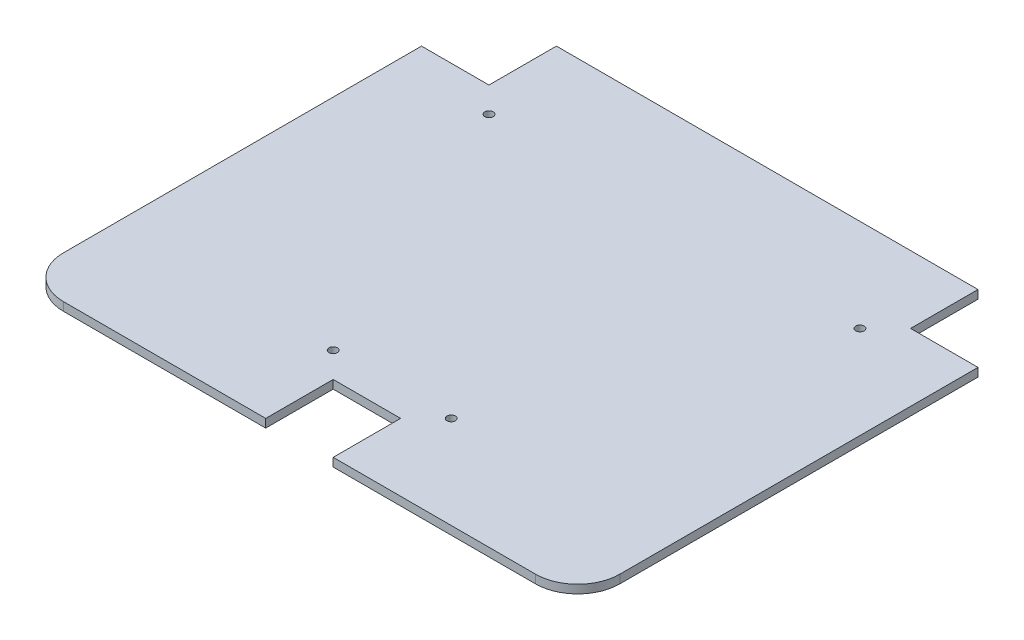
ISO-10303-21;
HEADER;
FILE_DESCRIPTION(('STEP AP214'),'2;1');
FILE_NAME('part.step','',(''),(''),'','','');
FILE_SCHEMA(('AUTOMOTIVE_DESIGN { 1 0 10303 214 1 1 1 1 }'));
ENDSEC;
DATA;
#1=APPLICATION_CONTEXT('core data for automotive mechanical design processes');
#2=APPLICATION_PROTOCOL_DEFINITION('international standard','automotive_design',2000,#1);
#3=PRODUCT_CONTEXT('',#1,'mechanical');
#4=PRODUCT('Part','Part','',(#3));
#5=PRODUCT_RELATED_PRODUCT_CATEGORY('part','',(#4));
#6=PRODUCT_DEFINITION_FORMATION('','',#4);
#7=PRODUCT_DEFINITION_CONTEXT('part definition',#1,'design');
#8=PRODUCT_DEFINITION('design','',#6,#7);
#9=PRODUCT_DEFINITION_SHAPE('','',#8);
#10=(LENGTH_UNIT() NAMED_UNIT(*) SI_UNIT(.MILLI.,.METRE.));
#11=(NAMED_UNIT(*) PLANE_ANGLE_UNIT() SI_UNIT($,.RADIAN.));
#12=(NAMED_UNIT(*) SI_UNIT($,.STERADIAN.) SOLID_ANGLE_UNIT());
#13=UNCERTAINTY_MEASURE_WITH_UNIT(LENGTH_MEASURE(1.E-05),#10,'distance_accuracy_value','');
#14=(GEOMETRIC_REPRESENTATION_CONTEXT(3) GLOBAL_UNCERTAINTY_ASSIGNED_CONTEXT((#13)) GLOBAL_UNIT_ASSIGNED_CONTEXT((#10,
#11,#12)) REPRESENTATION_CONTEXT('',''));
#15=CARTESIAN_POINT('',(0.,0.,0.));
#16=DIRECTION('',(0.,0.,1.));
#17=DIRECTION('',(1.,0.,0.));
#18=AXIS2_PLACEMENT_3D('',#15,#16,#17);
#19=CARTESIAN_POINT('',(0.,5.,155.796995794098));
#20=DIRECTION('',(0.,0.,1.));
#21=DIRECTION('',(1.,0.,0.));
#22=AXIS2_PLACEMENT_3D('',#19,#20,#21);
#23=PLANE('',#22);
#24=DIRECTION('',(-1.,0.,0.));
#25=VECTOR('',#24,1.);
#26=CARTESIAN_POINT('',(0.,0.,155.796995794098));
#27=LINE('',#26,#25);
#28=CARTESIAN_POINT('',(676.267355398383,0.,155.796995794098));
#29=VERTEX_POINT('',#28);
#30=CARTESIAN_POINT('',(556.267355398383,0.,155.796995794098));
#31=VERTEX_POINT('',#30);
#32=EDGE_CURVE('E175',#29,#31,#27,.T.);
#33=ORIENTED_EDGE('',*,*,#32,.F.);
#34=DIRECTION('',(0.,-1.,0.));
#35=VECTOR('',#34,1.);
#36=CARTESIAN_POINT('',(676.267355398383,5.,155.796995794098));
#37=LINE('',#36,#35);
#38=CARTESIAN_POINT('',(676.267355398383,5.,155.796995794098));
#39=VERTEX_POINT('',#38);
#40=EDGE_CURVE('E11',#39,#29,#37,.T.);
#41=ORIENTED_EDGE('',*,*,#40,.F.);
#42=DIRECTION('',(-1.,0.,0.));
#43=VECTOR('',#42,1.);
#44=CARTESIAN_POINT('',(0.,5.,155.796995794098));
#45=LINE('',#44,#43);
#46=CARTESIAN_POINT('',(556.267355398383,5.,155.796995794098));
#47=VERTEX_POINT('',#46);
#48=EDGE_CURVE('E227',#39,#47,#45,.T.);
#49=ORIENTED_EDGE('',*,*,#48,.T.);
#50=DIRECTION('',(0.,-1.,0.));
#51=VECTOR('',#50,1.);
#52=CARTESIAN_POINT('',(556.267355398383,5.,155.796995794098));
#53=LINE('',#52,#51);
#54=EDGE_CURVE('E58',#47,#31,#53,.T.);
#55=ORIENTED_EDGE('',*,*,#54,.T.);
#56=EDGE_LOOP('',(#33,#41,#49,#55));
#57=FACE_BOUND('',#56,.T.);
#58=ADVANCED_FACE('F41',(#57),#23,.T.);
#59=CARTESIAN_POINT('',(676.267355398383,5.,130.796995794098));
#60=DIRECTION('',(0.,-1.,0.));
#61=DIRECTION('',(0.,0.,-1.));
#62=AXIS2_PLACEMENT_3D('',#59,#60,#61);
#63=CYLINDRICAL_SURFACE('',#62,25.);
#64=CARTESIAN_POINT('',(676.267355398383,0.,130.796995794098));
#65=DIRECTION('',(0.,1.,0.));
#66=DIRECTION('',(0.,0.,1.));
#67=AXIS2_PLACEMENT_3D('',#64,#65,#66);
#68=CIRCLE('',#67,25.);
#69=CARTESIAN_POINT('',(701.267355398383,0.,130.796995794098));
#70=VERTEX_POINT('',#69);
#71=EDGE_CURVE('E178',#29,#70,#68,.T.);
#72=ORIENTED_EDGE('',*,*,#71,.T.);
#73=DIRECTION('',(0.,-1.,0.));
#74=VECTOR('',#73,1.);
#75=CARTESIAN_POINT('',(701.267355398383,5.,130.796995794098));
#76=LINE('',#75,#74);
#77=CARTESIAN_POINT('',(701.267355398383,5.,130.796995794098));
#78=VERTEX_POINT('',#77);
#79=EDGE_CURVE('E50',#78,#70,#76,.T.);
#80=ORIENTED_EDGE('',*,*,#79,.F.);
#81=CARTESIAN_POINT('',(676.267355398383,5.,130.796995794098));
#82=DIRECTION('',(0.,1.,0.));
#83=DIRECTION('',(0.,0.,1.));
#84=AXIS2_PLACEMENT_3D('',#81,#82,#83);
#85=CIRCLE('',#84,25.);
#86=EDGE_CURVE('E280',#39,#78,#85,.T.);
#87=ORIENTED_EDGE('',*,*,#86,.F.);
#88=ORIENTED_EDGE('',*,*,#40,.T.);
#89=EDGE_LOOP('',(#72,#80,#87,#88));
#90=FACE_BOUND('',#89,.T.);
#91=ADVANCED_FACE('F268',(#90),#63,.T.);
#92=CARTESIAN_POINT('',(701.267355398383,5.,0.));
#93=DIRECTION('',(1.,0.,0.));
#94=DIRECTION('',(0.,0.,-1.));
#95=AXIS2_PLACEMENT_3D('',#92,#93,#94);
#96=PLANE('',#95);
#97=DIRECTION('',(0.,0.,1.));
#98=VECTOR('',#97,1.);
#99=CARTESIAN_POINT('',(701.267355398383,0.,0.));
#100=LINE('',#99,#98);
#101=CARTESIAN_POINT('',(701.267355398383,0.,-81.5881877590993));
#102=VERTEX_POINT('',#101);
#103=EDGE_CURVE('E183',#102,#70,#100,.T.);
#104=ORIENTED_EDGE('',*,*,#103,.F.);
#105=DIRECTION('',(0.,-1.,0.));
#106=VECTOR('',#105,1.);
#107=CARTESIAN_POINT('',(701.267355398383,5.,-81.5881877590993));
#108=LINE('',#107,#106);
#109=CARTESIAN_POINT('',(701.267355398383,5.,-81.5881877590993));
#110=VERTEX_POINT('',#109);
#111=EDGE_CURVE('E256',#110,#102,#108,.T.);
#112=ORIENTED_EDGE('',*,*,#111,.F.);
#113=DIRECTION('',(0.,0.,1.));
#114=VECTOR('',#113,1.);
#115=CARTESIAN_POINT('',(701.267355398383,5.,0.));
#116=LINE('',#115,#114);
#117=EDGE_CURVE('E265',#110,#78,#116,.T.);
#118=ORIENTED_EDGE('',*,*,#117,.T.);
#119=ORIENTED_EDGE('',*,*,#79,.T.);
#120=EDGE_LOOP('',(#104,#112,#118,#119));
#121=FACE_BOUND('',#120,.T.);
#122=ADVANCED_FACE('F263',(#121),#96,.T.);
#123=CARTESIAN_POINT('',(0.,5.,-81.5881877590993));
#124=DIRECTION('',(0.,0.,-1.));
#125=DIRECTION('',(-1.,0.,0.));
#126=AXIS2_PLACEMENT_3D('',#123,#124,#125);
#127=PLANE('',#126);
#128=DIRECTION('',(1.,0.,0.));
#129=VECTOR('',#128,1.);
#130=CARTESIAN_POINT('',(0.,0.,-81.5881877590993));
#131=LINE('',#130,#129);
#132=CARTESIAN_POINT('',(661.267355398383,0.,-81.5881877590993));
#133=VERTEX_POINT('',#132);
#134=EDGE_CURVE('E187',#133,#102,#131,.T.);
#135=ORIENTED_EDGE('',*,*,#134,.F.);
#136=DIRECTION('',(0.,-1.,0.));
#137=VECTOR('',#136,1.);
#138=CARTESIAN_POINT('',(661.267355398383,5.,-81.5881877590993));
#139=LINE('',#138,#137);
#140=CARTESIAN_POINT('',(661.267355398383,5.,-81.5881877590993));
#141=VERTEX_POINT('',#140);
#142=EDGE_CURVE('E253',#141,#133,#139,.T.);
#143=ORIENTED_EDGE('',*,*,#142,.F.);
#144=DIRECTION('',(1.,0.,0.));
#145=VECTOR('',#144,1.);
#146=CARTESIAN_POINT('',(0.,5.,-81.5881877590993));
#147=LINE('',#146,#145);
#148=EDGE_CURVE('E277',#141,#110,#147,.T.);
#149=ORIENTED_EDGE('',*,*,#148,.T.);
#150=ORIENTED_EDGE('',*,*,#111,.T.);
#151=EDGE_LOOP('',(#135,#143,#149,#150));
#152=FACE_BOUND('',#151,.T.);
#153=ADVANCED_FACE('F274',(#152),#127,.T.);
#154=CARTESIAN_POINT('',(661.267355398383,5.,0.));
#155=DIRECTION('',(1.,0.,0.));
#156=DIRECTION('',(0.,0.,-1.));
#157=AXIS2_PLACEMENT_3D('',#154,#155,#156);
#158=PLANE('',#157);
#159=DIRECTION('',(0.,0.,1.));
#160=VECTOR('',#159,1.);
#161=CARTESIAN_POINT('',(661.267355398383,0.,0.));
#162=LINE('',#161,#160);
#163=CARTESIAN_POINT('',(661.267355398383,0.,-121.588187759099));
#164=VERTEX_POINT('',#163);
#165=EDGE_CURVE('E191',#164,#133,#162,.T.);
#166=ORIENTED_EDGE('',*,*,#165,.F.);
#167=DIRECTION('',(0.,-1.,0.));
#168=VECTOR('',#167,1.);
#169=CARTESIAN_POINT('',(661.267355398383,5.,-121.588187759099));
#170=LINE('',#169,#168);
#171=CARTESIAN_POINT('',(661.267355398383,5.,-121.588187759099));
#172=VERTEX_POINT('',#171);
#173=EDGE_CURVE('E250',#172,#164,#170,.T.);
#174=ORIENTED_EDGE('',*,*,#173,.F.);
#175=DIRECTION('',(0.,0.,1.));
#176=VECTOR('',#175,1.);
#177=CARTESIAN_POINT('',(661.267355398383,5.,0.));
#178=LINE('',#177,#176);
#179=EDGE_CURVE('E285',#172,#141,#178,.T.);
#180=ORIENTED_EDGE('',*,*,#179,.T.);
#181=ORIENTED_EDGE('',*,*,#142,.T.);
#182=EDGE_LOOP('',(#166,#174,#180,#181));
#183=FACE_BOUND('',#182,.T.);
#184=ADVANCED_FACE('F336',(#183),#158,.T.);
#185=CARTESIAN_POINT('',(0.,5.,-121.588187759099));
#186=DIRECTION('',(0.,0.,-1.));
#187=DIRECTION('',(-1.,0.,0.));
#188=AXIS2_PLACEMENT_3D('',#185,#186,#187);
#189=PLANE('',#188);
#190=DIRECTION('',(1.,0.,0.));
#191=VECTOR('',#190,1.);
#192=CARTESIAN_POINT('',(0.,0.,-121.588187759099));
#193=LINE('',#192,#191);
#194=CARTESIAN_POINT('',(411.267355398383,0.,-121.588187759099));
#195=VERTEX_POINT('',#194);
#196=EDGE_CURVE('E195',#195,#164,#193,.T.);
#197=ORIENTED_EDGE('',*,*,#196,.F.);
#198=DIRECTION('',(0.,-1.,0.));
#199=VECTOR('',#198,1.);
#200=CARTESIAN_POINT('',(411.267355398383,5.,-121.588187759099));
#201=LINE('',#200,#199);
#202=CARTESIAN_POINT('',(411.267355398383,5.,-121.588187759099));
#203=VERTEX_POINT('',#202);
#204=EDGE_CURVE('E247',#203,#195,#201,.T.);
#205=ORIENTED_EDGE('',*,*,#204,.F.);
#206=DIRECTION('',(1.,0.,0.));
#207=VECTOR('',#206,1.);
#208=CARTESIAN_POINT('',(0.,5.,-121.588187759099));
#209=LINE('',#208,#207);
#210=EDGE_CURVE('E292',#203,#172,#209,.T.);
#211=ORIENTED_EDGE('',*,*,#210,.T.);
#212=ORIENTED_EDGE('',*,*,#173,.T.);
#213=EDGE_LOOP('',(#197,#205,#211,#212));
#214=FACE_BOUND('',#213,.T.);
#215=ADVANCED_FACE('F339',(#214),#189,.T.);
#216=CARTESIAN_POINT('',(411.267355398383,5.,0.));
#217=DIRECTION('',(1.,0.,0.));
#218=DIRECTION('',(0.,0.,-1.));
#219=AXIS2_PLACEMENT_3D('',#216,#217,#218);
#220=PLANE('',#219);
#221=DIRECTION('',(0.,0.,1.));
#222=VECTOR('',#221,1.);
#223=CARTESIAN_POINT('',(411.267355398383,0.,0.));
#224=LINE('',#223,#222);
#225=CARTESIAN_POINT('',(411.267355398383,0.,-81.5881877590993));
#226=VERTEX_POINT('',#225);
#227=EDGE_CURVE('E199',#195,#226,#224,.T.);
#228=ORIENTED_EDGE('',*,*,#227,.T.);
#229=DIRECTION('',(0.,-1.,0.));
#230=VECTOR('',#229,1.);
#231=CARTESIAN_POINT('',(411.267355398383,5.,-81.5881877590993));
#232=LINE('',#231,#230);
#233=CARTESIAN_POINT('',(411.267355398383,5.,-81.5881877590993));
#234=VERTEX_POINT('',#233);
#235=EDGE_CURVE('E243',#234,#226,#232,.T.);
#236=ORIENTED_EDGE('',*,*,#235,.F.);
#237=DIRECTION('',(0.,0.,1.));
#238=VECTOR('',#237,1.);
#239=CARTESIAN_POINT('',(411.267355398383,5.,0.));
#240=LINE('',#239,#238);
#241=EDGE_CURVE('E296',#203,#234,#240,.T.);
#242=ORIENTED_EDGE('',*,*,#241,.F.);
#243=ORIENTED_EDGE('',*,*,#204,.T.);
#244=EDGE_LOOP('',(#228,#236,#242,#243));
#245=FACE_BOUND('',#244,.T.);
#246=ADVANCED_FACE('F343',(#245),#220,.F.);
#247=CARTESIAN_POINT('',(0.,5.,-81.5881877590993));
#248=DIRECTION('',(0.,0.,1.));
#249=DIRECTION('',(1.,0.,0.));
#250=AXIS2_PLACEMENT_3D('',#247,#248,#249);
#251=PLANE('',#250);
#252=DIRECTION('',(-1.,0.,0.));
#253=VECTOR('',#252,1.);
#254=CARTESIAN_POINT('',(0.,0.,-81.5881877590993));
#255=LINE('',#254,#253);
#256=CARTESIAN_POINT('',(371.267355398383,0.,-81.5881877590993));
#257=VERTEX_POINT('',#256);
#258=EDGE_CURVE('E202',#226,#257,#255,.T.);
#259=ORIENTED_EDGE('',*,*,#258,.T.);
#260=DIRECTION('',(0.,-1.,0.));
#261=VECTOR('',#260,1.);
#262=CARTESIAN_POINT('',(371.267355398383,5.,-81.5881877590993));
#263=LINE('',#262,#261);
#264=CARTESIAN_POINT('',(371.267355398383,5.,-81.5881877590993));
#265=VERTEX_POINT('',#264);
#266=EDGE_CURVE('E240',#265,#257,#263,.T.);
#267=ORIENTED_EDGE('',*,*,#266,.F.);
#268=DIRECTION('',(-1.,0.,0.));
#269=VECTOR('',#268,1.);
#270=CARTESIAN_POINT('',(0.,5.,-81.5881877590993));
#271=LINE('',#270,#269);
#272=EDGE_CURVE('E299',#234,#265,#271,.T.);
#273=ORIENTED_EDGE('',*,*,#272,.F.);
#274=ORIENTED_EDGE('',*,*,#235,.T.);
#275=EDGE_LOOP('',(#259,#267,#273,#274));
#276=FACE_BOUND('',#275,.T.);
#277=ADVANCED_FACE('F347',(#276),#251,.F.);
#278=CARTESIAN_POINT('',(371.267355398383,5.,0.));
#279=DIRECTION('',(-1.,0.,0.));
#280=DIRECTION('',(0.,0.,1.));
#281=AXIS2_PLACEMENT_3D('',#278,#279,#280);
#282=PLANE('',#281);
#283=DIRECTION('',(0.,0.,-1.));
#284=VECTOR('',#283,1.);
#285=CARTESIAN_POINT('',(371.267355398383,0.,0.));
#286=LINE('',#285,#284);
#287=CARTESIAN_POINT('',(371.267355398383,0.,130.796995794098));
#288=VERTEX_POINT('',#287);
#289=EDGE_CURVE('E206',#288,#257,#286,.T.);
#290=ORIENTED_EDGE('',*,*,#289,.F.);
#291=DIRECTION('',(0.,-1.,0.));
#292=VECTOR('',#291,1.);
#293=CARTESIAN_POINT('',(371.267355398383,5.,130.796995794098));
#294=LINE('',#293,#292);
#295=CARTESIAN_POINT('',(371.267355398383,5.,130.796995794098));
#296=VERTEX_POINT('',#295);
#297=EDGE_CURVE('E237',#296,#288,#294,.T.);
#298=ORIENTED_EDGE('',*,*,#297,.F.);
#299=DIRECTION('',(0.,0.,-1.));
#300=VECTOR('',#299,1.);
#301=CARTESIAN_POINT('',(371.267355398383,5.,0.));
#302=LINE('',#301,#300);
#303=EDGE_CURVE('E302',#296,#265,#302,.T.);
#304=ORIENTED_EDGE('',*,*,#303,.T.);
#305=ORIENTED_EDGE('',*,*,#266,.T.);
#306=EDGE_LOOP('',(#290,#298,#304,#305));
#307=FACE_BOUND('',#306,.T.);
#308=ADVANCED_FACE('F351',(#307),#282,.T.);
#309=CARTESIAN_POINT('',(396.267355398383,5.,130.796995794098));
#310=DIRECTION('',(0.,-1.,0.));
#311=DIRECTION('',(0.,0.,-1.));
#312=AXIS2_PLACEMENT_3D('',#309,#310,#311);
#313=CYLINDRICAL_SURFACE('',#312,25.);
#314=CARTESIAN_POINT('',(396.267355398383,0.,130.796995794098));
#315=DIRECTION('',(0.,1.,0.));
#316=DIRECTION('',(0.,0.,1.));
#317=AXIS2_PLACEMENT_3D('',#314,#315,#316);
#318=CIRCLE('',#317,25.);
#319=CARTESIAN_POINT('',(396.267355398384,0.,155.796995794098));
#320=VERTEX_POINT('',#319);
#321=EDGE_CURVE('E210',#288,#320,#318,.T.);
#322=ORIENTED_EDGE('',*,*,#321,.T.);
#323=DIRECTION('',(0.,-1.,0.));
#324=VECTOR('',#323,1.);
#325=CARTESIAN_POINT('',(396.267355398384,5.,155.796995794098));
#326=LINE('',#325,#324);
#327=CARTESIAN_POINT('',(396.267355398384,5.,155.796995794098));
#328=VERTEX_POINT('',#327);
#329=EDGE_CURVE('E234',#328,#320,#326,.T.);
#330=ORIENTED_EDGE('',*,*,#329,.F.);
#331=CARTESIAN_POINT('',(396.267355398383,5.,130.796995794098));
#332=DIRECTION('',(0.,1.,0.));
#333=DIRECTION('',(0.,0.,1.));
#334=AXIS2_PLACEMENT_3D('',#331,#332,#333);
#335=CIRCLE('',#334,25.);
#336=EDGE_CURVE('E306',#296,#328,#335,.T.);
#337=ORIENTED_EDGE('',*,*,#336,.F.);
#338=ORIENTED_EDGE('',*,*,#297,.T.);
#339=EDGE_LOOP('',(#322,#330,#337,#338));
#340=FACE_BOUND('',#339,.T.);
#341=ADVANCED_FACE('F355',(#340),#313,.T.);
#342=CARTESIAN_POINT('',(0.,5.,155.796995794098));
#343=DIRECTION('',(0.,0.,1.));
#344=DIRECTION('',(1.,0.,0.));
#345=AXIS2_PLACEMENT_3D('',#342,#343,#344);
#346=PLANE('',#345);
#347=DIRECTION('',(-1.,0.,0.));
#348=VECTOR('',#347,1.);
#349=CARTESIAN_POINT('',(0.,0.,155.796995794098));
#350=LINE('',#349,#348);
#351=CARTESIAN_POINT('',(516.267355398383,0.,155.796995794098));
#352=VERTEX_POINT('',#351);
#353=EDGE_CURVE('E214',#352,#320,#350,.T.);
#354=ORIENTED_EDGE('',*,*,#353,.F.);
#355=DIRECTION('',(0.,-1.,0.));
#356=VECTOR('',#355,1.);
#357=CARTESIAN_POINT('',(516.267355398383,5.,155.796995794098));
#358=LINE('',#357,#356);
#359=CARTESIAN_POINT('',(516.267355398383,5.,155.796995794098));
#360=VERTEX_POINT('',#359);
#361=EDGE_CURVE('E154',#360,#352,#358,.T.);
#362=ORIENTED_EDGE('',*,*,#361,.F.);
#363=DIRECTION('',(-1.,0.,0.));
#364=VECTOR('',#363,1.);
#365=CARTESIAN_POINT('',(0.,5.,155.796995794098));
#366=LINE('',#365,#364);
#367=EDGE_CURVE('E164',#360,#328,#366,.T.);
#368=ORIENTED_EDGE('',*,*,#367,.T.);
#369=ORIENTED_EDGE('',*,*,#329,.T.);
#370=EDGE_LOOP('',(#354,#362,#368,#369));
#371=FACE_BOUND('',#370,.T.);
#372=ADVANCED_FACE('F311',(#371),#346,.T.);
#373=CARTESIAN_POINT('',(516.267355398383,5.,0.));
#374=DIRECTION('',(1.,0.,0.));
#375=DIRECTION('',(0.,0.,-1.));
#376=AXIS2_PLACEMENT_3D('',#373,#374,#375);
#377=PLANE('',#376);
#378=DIRECTION('',(0.,0.,1.));
#379=VECTOR('',#378,1.);
#380=CARTESIAN_POINT('',(516.267355398383,0.,0.));
#381=LINE('',#380,#379);
#382=CARTESIAN_POINT('',(516.267355398383,0.,115.796995794098));
#383=VERTEX_POINT('',#382);
#384=EDGE_CURVE('E149',#383,#352,#381,.T.);
#385=ORIENTED_EDGE('',*,*,#384,.F.);
#386=DIRECTION('',(0.,-1.,0.));
#387=VECTOR('',#386,1.);
#388=CARTESIAN_POINT('',(516.267355398383,5.,115.796995794098));
#389=LINE('',#388,#387);
#390=CARTESIAN_POINT('',(516.267355398383,5.,115.796995794098));
#391=VERTEX_POINT('',#390);
#392=EDGE_CURVE('E144',#391,#383,#389,.T.);
#393=ORIENTED_EDGE('',*,*,#392,.F.);
#394=DIRECTION('',(0.,0.,1.));
#395=VECTOR('',#394,1.);
#396=CARTESIAN_POINT('',(516.267355398383,5.,0.));
#397=LINE('',#396,#395);
#398=EDGE_CURVE('E147',#391,#360,#397,.T.);
#399=ORIENTED_EDGE('',*,*,#398,.T.);
#400=ORIENTED_EDGE('',*,*,#361,.T.);
#401=EDGE_LOOP('',(#385,#393,#399,#400));
#402=FACE_BOUND('',#401,.T.);
#403=ADVANCED_FACE('F146',(#402),#377,.T.);
#404=CARTESIAN_POINT('',(0.,5.,115.796995794098));
#405=DIRECTION('',(0.,0.,1.));
#406=DIRECTION('',(1.,0.,0.));
#407=AXIS2_PLACEMENT_3D('',#404,#405,#406);
#408=PLANE('',#407);
#409=DIRECTION('',(-1.,0.,0.));
#410=VECTOR('',#409,1.);
#411=CARTESIAN_POINT('',(0.,0.,115.796995794098));
#412=LINE('',#411,#410);
#413=CARTESIAN_POINT('',(556.267355398383,0.,115.796995794098));
#414=VERTEX_POINT('',#413);
#415=EDGE_CURVE('E220',#414,#383,#412,.T.);
#416=ORIENTED_EDGE('',*,*,#415,.F.);
#417=DIRECTION('',(0.,-1.,0.));
#418=VECTOR('',#417,1.);
#419=CARTESIAN_POINT('',(556.267355398383,5.,115.796995794098));
#420=LINE('',#419,#418);
#421=CARTESIAN_POINT('',(556.267355398383,5.,115.796995794098));
#422=VERTEX_POINT('',#421);
#423=EDGE_CURVE('E101',#422,#414,#420,.T.);
#424=ORIENTED_EDGE('',*,*,#423,.F.);
#425=DIRECTION('',(-1.,0.,0.));
#426=VECTOR('',#425,1.);
#427=CARTESIAN_POINT('',(0.,5.,115.796995794098));
#428=LINE('',#427,#426);
#429=EDGE_CURVE('E162',#422,#391,#428,.T.);
#430=ORIENTED_EDGE('',*,*,#429,.T.);
#431=ORIENTED_EDGE('',*,*,#392,.T.);
#432=EDGE_LOOP('',(#416,#424,#430,#431));
#433=FACE_BOUND('',#432,.T.);
#434=ADVANCED_FACE('F167',(#433),#408,.T.);
#435=CARTESIAN_POINT('',(556.267355398383,5.,0.));
#436=DIRECTION('',(-1.,0.,0.));
#437=DIRECTION('',(0.,0.,1.));
#438=AXIS2_PLACEMENT_3D('',#435,#436,#437);
#439=PLANE('',#438);
#440=DIRECTION('',(0.,0.,-1.));
#441=VECTOR('',#440,1.);
#442=CARTESIAN_POINT('',(556.267355398383,0.,0.));
#443=LINE('',#442,#441);
#444=EDGE_CURVE('E223',#31,#414,#443,.T.);
#445=ORIENTED_EDGE('',*,*,#444,.F.);
#446=ORIENTED_EDGE('',*,*,#54,.F.);
#447=DIRECTION('',(0.,0.,-1.));
#448=VECTOR('',#447,1.);
#449=CARTESIAN_POINT('',(556.267355398383,5.,0.));
#450=LINE('',#449,#448);
#451=EDGE_CURVE('E169',#47,#422,#450,.T.);
#452=ORIENTED_EDGE('',*,*,#451,.T.);
#453=ORIENTED_EDGE('',*,*,#423,.T.);
#454=EDGE_LOOP('',(#445,#446,#452,#453));
#455=FACE_BOUND('',#454,.T.);
#456=ADVANCED_FACE('F314',(#455),#439,.T.);
#457=CARTESIAN_POINT('',(0.,5.,0.));
#458=DIRECTION('',(0.,1.,0.));
#459=DIRECTION('',(0.,0.,1.));
#460=AXIS2_PLACEMENT_3D('',#457,#458,#459);
#461=PLANE('',#460);
#462=CARTESIAN_POINT('',(426.267355398383,5.,-66.5881877590993));
#463=DIRECTION('',(0.,1.,0.));
#464=DIRECTION('',(0.,0.,1.));
#465=AXIS2_PLACEMENT_3D('',#462,#463,#464);
#466=CIRCLE('',#465,2.50000000000002);
#467=CARTESIAN_POINT('',(426.267355398383,5.,-64.0881877590993));
#468=VERTEX_POINT('',#467);
#469=EDGE_CURVE('E439',#468,#468,#466,.T.);
#470=ORIENTED_EDGE('',*,*,#469,.F.);
#471=EDGE_LOOP('',(#470));
#472=FACE_BOUND('',#471,.T.);
#473=CARTESIAN_POINT('',(646.267355398383,5.,-66.5881877590992));
#474=DIRECTION('',(0.,1.,0.));
#475=DIRECTION('',(0.,0.,1.));
#476=AXIS2_PLACEMENT_3D('',#473,#474,#475);
#477=CIRCLE('',#476,2.50000000000003);
#478=CARTESIAN_POINT('',(646.267355398383,5.,-64.0881877590992));
#479=VERTEX_POINT('',#478);
#480=EDGE_CURVE('E443',#479,#479,#477,.T.);
#481=ORIENTED_EDGE('',*,*,#480,.F.);
#482=EDGE_LOOP('',(#481));
#483=FACE_BOUND('',#482,.T.);
#484=CARTESIAN_POINT('',(501.267355398383,5.,100.796995794098));
#485=DIRECTION('',(0.,1.,0.));
#486=DIRECTION('',(0.,0.,1.));
#487=AXIS2_PLACEMENT_3D('',#484,#485,#486);
#488=CIRCLE('',#487,2.50000000000003);
#489=CARTESIAN_POINT('',(501.267355398383,5.,103.296995794098));
#490=VERTEX_POINT('',#489);
#491=EDGE_CURVE('E458',#490,#490,#488,.T.);
#492=ORIENTED_EDGE('',*,*,#491,.F.);
#493=EDGE_LOOP('',(#492));
#494=FACE_BOUND('',#493,.T.);
#495=CARTESIAN_POINT('',(571.267355398383,5.,100.796995794098));
#496=DIRECTION('',(0.,1.,0.));
#497=DIRECTION('',(0.,0.,1.));
#498=AXIS2_PLACEMENT_3D('',#495,#496,#497);
#499=CIRCLE('',#498,2.50000000000003);
#500=CARTESIAN_POINT('',(571.267355398383,5.,103.296995794098));
#501=VERTEX_POINT('',#500);
#502=EDGE_CURVE('E450',#501,#501,#499,.T.);
#503=ORIENTED_EDGE('',*,*,#502,.F.);
#504=EDGE_LOOP('',(#503));
#505=FACE_BOUND('',#504,.T.);
#506=ORIENTED_EDGE('',*,*,#48,.F.);
#507=ORIENTED_EDGE('',*,*,#86,.T.);
#508=ORIENTED_EDGE('',*,*,#117,.F.);
#509=ORIENTED_EDGE('',*,*,#148,.F.);
#510=ORIENTED_EDGE('',*,*,#179,.F.);
#511=ORIENTED_EDGE('',*,*,#210,.F.);
#512=ORIENTED_EDGE('',*,*,#241,.T.);
#513=ORIENTED_EDGE('',*,*,#272,.T.);
#514=ORIENTED_EDGE('',*,*,#303,.F.);
#515=ORIENTED_EDGE('',*,*,#336,.T.);
#516=ORIENTED_EDGE('',*,*,#367,.F.);
#517=ORIENTED_EDGE('',*,*,#398,.F.);
#518=ORIENTED_EDGE('',*,*,#429,.F.);
#519=ORIENTED_EDGE('',*,*,#451,.F.);
#520=EDGE_LOOP('',(#506,#507,#508,#509,#510,#511,#512,#513,#514,#515,#516,#517,#518,#519));
#521=FACE_BOUND('',#520,.T.);
#522=ADVANCED_FACE('F160',(#472,#483,#494,#505,#521),#461,.T.);
#523=CARTESIAN_POINT('',(0.,0.,0.));
#524=DIRECTION('',(0.,1.,0.));
#525=DIRECTION('',(0.,0.,1.));
#526=AXIS2_PLACEMENT_3D('',#523,#524,#525);
#527=PLANE('',#526);
#528=CARTESIAN_POINT('',(426.267355398383,0.,-66.5881877590993));
#529=DIRECTION('',(0.,1.,0.));
#530=DIRECTION('',(0.,0.,1.));
#531=AXIS2_PLACEMENT_3D('',#528,#529,#530);
#532=CIRCLE('',#531,2.50000000000002);
#533=CARTESIAN_POINT('',(426.267355398383,0.,-64.0881877590993));
#534=VERTEX_POINT('',#533);
#535=EDGE_CURVE('E436',#534,#534,#532,.T.);
#536=ORIENTED_EDGE('',*,*,#535,.T.);
#537=EDGE_LOOP('',(#536));
#538=FACE_BOUND('',#537,.T.);
#539=CARTESIAN_POINT('',(646.267355398383,0.,-66.5881877590992));
#540=DIRECTION('',(0.,1.,0.));
#541=DIRECTION('',(0.,0.,1.));
#542=AXIS2_PLACEMENT_3D('',#539,#540,#541);
#543=CIRCLE('',#542,2.50000000000003);
#544=CARTESIAN_POINT('',(646.267355398383,0.,-64.0881877590992));
#545=VERTEX_POINT('',#544);
#546=EDGE_CURVE('E462',#545,#545,#543,.T.);
#547=ORIENTED_EDGE('',*,*,#546,.T.);
#548=EDGE_LOOP('',(#547));
#549=FACE_BOUND('',#548,.T.);
#550=CARTESIAN_POINT('',(501.267355398383,0.,100.796995794098));
#551=DIRECTION('',(0.,1.,0.));
#552=DIRECTION('',(0.,0.,1.));
#553=AXIS2_PLACEMENT_3D('',#550,#551,#552);
#554=CIRCLE('',#553,2.50000000000003);
#555=CARTESIAN_POINT('',(501.267355398383,0.,103.296995794098));
#556=VERTEX_POINT('',#555);
#557=EDGE_CURVE('E453',#556,#556,#554,.T.);
#558=ORIENTED_EDGE('',*,*,#557,.T.);
#559=EDGE_LOOP('',(#558));
#560=FACE_BOUND('',#559,.T.);
#561=CARTESIAN_POINT('',(571.267355398383,0.,100.796995794098));
#562=DIRECTION('',(0.,1.,0.));
#563=DIRECTION('',(0.,0.,1.));
#564=AXIS2_PLACEMENT_3D('',#561,#562,#563);
#565=CIRCLE('',#564,2.50000000000003);
#566=CARTESIAN_POINT('',(571.267355398383,0.,103.296995794098));
#567=VERTEX_POINT('',#566);
#568=EDGE_CURVE('E179',#567,#567,#565,.T.);
#569=ORIENTED_EDGE('',*,*,#568,.T.);
#570=EDGE_LOOP('',(#569));
#571=FACE_BOUND('',#570,.T.);
#572=ORIENTED_EDGE('',*,*,#32,.T.);
#573=ORIENTED_EDGE('',*,*,#444,.T.);
#574=ORIENTED_EDGE('',*,*,#415,.T.);
#575=ORIENTED_EDGE('',*,*,#384,.T.);
#576=ORIENTED_EDGE('',*,*,#353,.T.);
#577=ORIENTED_EDGE('',*,*,#321,.F.);
#578=ORIENTED_EDGE('',*,*,#289,.T.);
#579=ORIENTED_EDGE('',*,*,#258,.F.);
#580=ORIENTED_EDGE('',*,*,#227,.F.);
#581=ORIENTED_EDGE('',*,*,#196,.T.);
#582=ORIENTED_EDGE('',*,*,#165,.T.);
#583=ORIENTED_EDGE('',*,*,#134,.T.);
#584=ORIENTED_EDGE('',*,*,#103,.T.);
#585=ORIENTED_EDGE('',*,*,#71,.F.);
#586=EDGE_LOOP('',(#572,#573,#574,#575,#576,#577,#578,#579,#580,#581,#582,#583,#584,#585));
#587=FACE_BOUND('',#586,.T.);
#588=ADVANCED_FACE('F270',(#538,#549,#560,#571,#587),#527,.F.);
#589=CARTESIAN_POINT('',(571.267355398383,0.,100.796995794098));
#590=DIRECTION('',(0.,1.,0.));
#591=DIRECTION('',(0.,0.,1.));
#592=AXIS2_PLACEMENT_3D('',#589,#590,#591);
#593=CYLINDRICAL_SURFACE('',#592,2.50000000000003);
#594=ORIENTED_EDGE('',*,*,#568,.F.);
#595=EDGE_LOOP('',(#594));
#596=FACE_BOUND('',#595,.T.);
#597=ORIENTED_EDGE('',*,*,#502,.T.);
#598=EDGE_LOOP('',(#597));
#599=FACE_BOUND('',#598,.T.);
#600=ADVANCED_FACE('F390',(#596,#599),#593,.F.);
#601=CARTESIAN_POINT('',(501.267355398383,0.,100.796995794098));
#602=DIRECTION('',(0.,1.,0.));
#603=DIRECTION('',(0.,0.,1.));
#604=AXIS2_PLACEMENT_3D('',#601,#602,#603);
#605=CYLINDRICAL_SURFACE('',#604,2.50000000000003);
#606=ORIENTED_EDGE('',*,*,#557,.F.);
#607=EDGE_LOOP('',(#606));
#608=FACE_BOUND('',#607,.T.);
#609=ORIENTED_EDGE('',*,*,#491,.T.);
#610=EDGE_LOOP('',(#609));
#611=FACE_BOUND('',#610,.T.);
#612=ADVANCED_FACE('F399',(#608,#611),#605,.F.);
#613=CARTESIAN_POINT('',(646.267355398383,0.,-66.5881877590992));
#614=DIRECTION('',(0.,1.,0.));
#615=DIRECTION('',(0.,0.,1.));
#616=AXIS2_PLACEMENT_3D('',#613,#614,#615);
#617=CYLINDRICAL_SURFACE('',#616,2.50000000000003);
#618=ORIENTED_EDGE('',*,*,#546,.F.);
#619=EDGE_LOOP('',(#618));
#620=FACE_BOUND('',#619,.T.);
#621=ORIENTED_EDGE('',*,*,#480,.T.);
#622=EDGE_LOOP('',(#621));
#623=FACE_BOUND('',#622,.T.);
#624=ADVANCED_FACE('F409',(#620,#623),#617,.F.);
#625=CARTESIAN_POINT('',(426.267355398383,0.,-66.5881877590993));
#626=DIRECTION('',(0.,1.,0.));
#627=DIRECTION('',(0.,0.,1.));
#628=AXIS2_PLACEMENT_3D('',#625,#626,#627);
#629=CYLINDRICAL_SURFACE('',#628,2.50000000000002);
#630=ORIENTED_EDGE('',*,*,#535,.F.);
#631=EDGE_LOOP('',(#630));
#632=FACE_BOUND('',#631,.T.);
#633=ORIENTED_EDGE('',*,*,#469,.T.);
#634=EDGE_LOOP('',(#633));
#635=FACE_BOUND('',#634,.T.);
#636=ADVANCED_FACE('F419',(#632,#635),#629,.F.);
#637=CLOSED_SHELL('',(#58,#91,#122,#153,#184,#215,#246,#277,#308,#341,#372,#403,#434,#456,#522,
#588,#600,#612,#624,#636));
#638=MANIFOLD_SOLID_BREP('B2',#637);
#639=ADVANCED_BREP_SHAPE_REPRESENTATION('',(#18,#638),#14);
#640=SHAPE_DEFINITION_REPRESENTATION(#9,#639);
ENDSEC;
END-ISO-10303-21;
